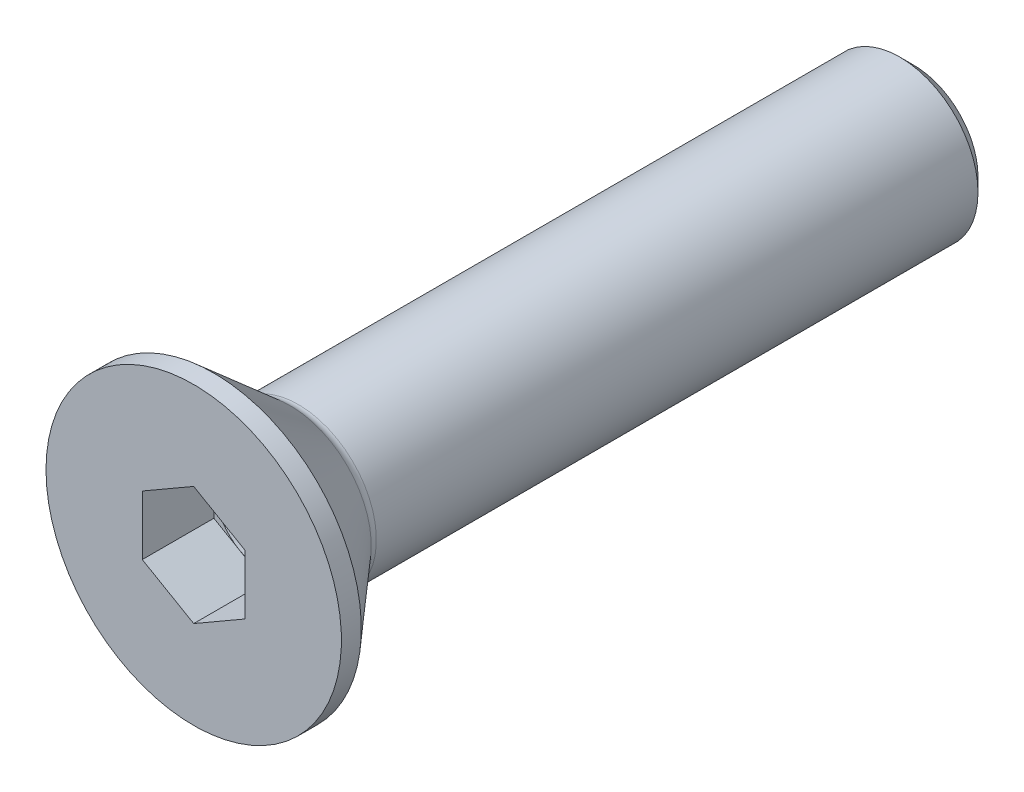
ISO-10303-21;
HEADER;
FILE_DESCRIPTION(('STEP AP214'),'2;1');
FILE_NAME('part.step','',(''),(''),'','','');
FILE_SCHEMA(('AUTOMOTIVE_DESIGN { 1 0 10303 214 1 1 1 1 }'));
ENDSEC;
DATA;
#1=APPLICATION_CONTEXT('core data for automotive mechanical design processes');
#2=APPLICATION_PROTOCOL_DEFINITION('international standard','automotive_design',2000,#1);
#3=PRODUCT_CONTEXT('',#1,'mechanical');
#4=PRODUCT('Part','Part','',(#3));
#5=PRODUCT_RELATED_PRODUCT_CATEGORY('part','',(#4));
#6=PRODUCT_DEFINITION_FORMATION('','',#4);
#7=PRODUCT_DEFINITION_CONTEXT('part definition',#1,'design');
#8=PRODUCT_DEFINITION('design','',#6,#7);
#9=PRODUCT_DEFINITION_SHAPE('','',#8);
#10=(LENGTH_UNIT() NAMED_UNIT(*) SI_UNIT(.MILLI.,.METRE.));
#11=(NAMED_UNIT(*) PLANE_ANGLE_UNIT() SI_UNIT($,.RADIAN.));
#12=(NAMED_UNIT(*) SI_UNIT($,.STERADIAN.) SOLID_ANGLE_UNIT());
#13=UNCERTAINTY_MEASURE_WITH_UNIT(LENGTH_MEASURE(1.E-05),#10,'distance_accuracy_value','');
#14=(GEOMETRIC_REPRESENTATION_CONTEXT(3) GLOBAL_UNCERTAINTY_ASSIGNED_CONTEXT((#13)) GLOBAL_UNIT_ASSIGNED_CONTEXT((#10,
#11,#12)) REPRESENTATION_CONTEXT('',''));
#15=CARTESIAN_POINT('',(0.,0.,0.));
#16=DIRECTION('',(0.,0.,1.));
#17=DIRECTION('',(1.,0.,0.));
#18=AXIS2_PLACEMENT_3D('',#15,#16,#17);
#19=CARTESIAN_POINT('',(0.,0.,-2.2098));
#20=DIRECTION('',(0.,0.,1.));
#21=DIRECTION('',(1.,0.,0.));
#22=AXIS2_PLACEMENT_3D('',#19,#20,#21);
#23=PLANE('',#22);
#24=CARTESIAN_POINT('',(0.,0.,-2.2098));
#25=DIRECTION('',(0.,0.,1.));
#26=DIRECTION('',(1.,0.,0.));
#27=AXIS2_PLACEMENT_3D('',#24,#25,#26);
#28=CIRCLE('',#27,1.5875);
#29=CARTESIAN_POINT('',(1.5875,0.,-2.2098));
#30=VERTEX_POINT('',#29);
#31=CARTESIAN_POINT('',(0.79375,1.3748153285078,-2.2098));
#32=VERTEX_POINT('',#31);
#33=EDGE_CURVE('E96',#30,#32,#28,.T.);
#34=ORIENTED_EDGE('',*,*,#33,.F.);
#35=DIRECTION('',(0.,-1.,0.));
#36=VECTOR('',#35,1.);
#37=CARTESIAN_POINT('',(1.5875,0.,-2.2098));
#38=LINE('',#37,#36);
#39=CARTESIAN_POINT('',(1.5875,0.91654355233853,-2.2098));
#40=VERTEX_POINT('',#39);
#41=EDGE_CURVE('E120',#40,#30,#38,.T.);
#42=ORIENTED_EDGE('',*,*,#41,.F.);
#43=DIRECTION('',(0.866025403784439,-0.5,0.));
#44=VECTOR('',#43,1.);
#45=CARTESIAN_POINT('',(1.82027223185862,0.782152441615087,-2.2098));
#46=LINE('',#45,#44);
#47=EDGE_CURVE('E118',#32,#40,#46,.T.);
#48=ORIENTED_EDGE('',*,*,#47,.F.);
#49=EDGE_LOOP('',(#34,#42,#48));
#50=FACE_BOUND('',#49,.T.);
#51=ADVANCED_FACE('F17',(#50),#23,.T.);
#52=CARTESIAN_POINT('',(-0.79375,1.3748153285078,-2.2098));
#53=VERTEX_POINT('',#52);
#54=EDGE_CURVE('E98',#32,#53,#28,.T.);
#55=ORIENTED_EDGE('',*,*,#54,.F.);
#56=CARTESIAN_POINT('',(0.,1.83308710467706,-2.2098));
#57=VERTEX_POINT('',#56);
#58=EDGE_CURVE('E113',#57,#32,#46,.T.);
#59=ORIENTED_EDGE('',*,*,#58,.F.);
#60=DIRECTION('',(0.866025403784438,0.5,0.));
#61=VECTOR('',#60,1.);
#62=CARTESIAN_POINT('',(-1.82027223185862,0.782152441615086,-2.2098));
#63=LINE('',#62,#61);
#64=EDGE_CURVE('E114',#53,#57,#63,.T.);
#65=ORIENTED_EDGE('',*,*,#64,.F.);
#66=EDGE_LOOP('',(#55,#59,#65));
#67=FACE_BOUND('',#66,.T.);
#68=ADVANCED_FACE('F111',(#67),#23,.T.);
#69=CARTESIAN_POINT('',(-1.5875,0.,-2.2098));
#70=VERTEX_POINT('',#69);
#71=EDGE_CURVE('E117',#53,#70,#28,.T.);
#72=ORIENTED_EDGE('',*,*,#71,.F.);
#73=CARTESIAN_POINT('',(-1.5875,0.91654355233853,-2.2098));
#74=VERTEX_POINT('',#73);
#75=EDGE_CURVE('E134',#74,#53,#63,.T.);
#76=ORIENTED_EDGE('',*,*,#75,.F.);
#77=DIRECTION('',(0.,1.,0.));
#78=VECTOR('',#77,1.);
#79=CARTESIAN_POINT('',(-1.5875,0.,-2.2098));
#80=LINE('',#79,#78);
#81=EDGE_CURVE('E138',#70,#74,#80,.T.);
#82=ORIENTED_EDGE('',*,*,#81,.F.);
#83=EDGE_LOOP('',(#72,#76,#82));
#84=FACE_BOUND('',#83,.T.);
#85=ADVANCED_FACE('F222',(#84),#23,.T.);
#86=CARTESIAN_POINT('',(-0.79375,-1.3748153285078,-2.2098));
#87=VERTEX_POINT('',#86);
#88=EDGE_CURVE('E247',#70,#87,#28,.T.);
#89=ORIENTED_EDGE('',*,*,#88,.F.);
#90=CARTESIAN_POINT('',(-1.5875,-0.91654355233853,-2.2098));
#91=VERTEX_POINT('',#90);
#92=EDGE_CURVE('E139',#91,#70,#80,.T.);
#93=ORIENTED_EDGE('',*,*,#92,.F.);
#94=DIRECTION('',(-0.866025403784439,0.5,0.));
#95=VECTOR('',#94,1.);
#96=CARTESIAN_POINT('',(0.232772231858619,-1.96747821540051,-2.2098));
#97=LINE('',#96,#95);
#98=EDGE_CURVE('E143',#87,#91,#97,.T.);
#99=ORIENTED_EDGE('',*,*,#98,.F.);
#100=EDGE_LOOP('',(#89,#93,#99));
#101=FACE_BOUND('',#100,.T.);
#102=ADVANCED_FACE('F234',(#101),#23,.T.);
#103=CARTESIAN_POINT('',(0.79375,-1.3748153285078,-2.2098));
#104=VERTEX_POINT('',#103);
#105=EDGE_CURVE('E33',#87,#104,#28,.T.);
#106=ORIENTED_EDGE('',*,*,#105,.F.);
#107=CARTESIAN_POINT('',(0.,-1.83308710467706,-2.2098));
#108=VERTEX_POINT('',#107);
#109=EDGE_CURVE('E144',#108,#87,#97,.T.);
#110=ORIENTED_EDGE('',*,*,#109,.F.);
#111=DIRECTION('',(-0.866025403784438,-0.5,0.));
#112=VECTOR('',#111,1.);
#113=CARTESIAN_POINT('',(1.82027223185862,-0.782152441615086,-2.2098));
#114=LINE('',#113,#112);
#115=EDGE_CURVE('E148',#104,#108,#114,.T.);
#116=ORIENTED_EDGE('',*,*,#115,.F.);
#117=EDGE_LOOP('',(#106,#110,#116));
#118=FACE_BOUND('',#117,.T.);
#119=ADVANCED_FACE('F227',(#118),#23,.T.);
#120=CARTESIAN_POINT('',(-2.27965,0.,0.));
#121=DIRECTION('',(0.,0.,-1.));
#122=DIRECTION('',(-1.,0.,0.));
#123=AXIS2_PLACEMENT_3D('',#120,#121,#122);
#124=PLANE('',#123);
#125=CARTESIAN_POINT('',(0.,0.,0.));
#126=DIRECTION('',(0.,0.,-1.));
#127=DIRECTION('',(-1.,0.,0.));
#128=AXIS2_PLACEMENT_3D('',#125,#126,#127);
#129=CIRCLE('',#128,4.5593);
#130=CARTESIAN_POINT('',(-4.5593,0.,0.));
#131=VERTEX_POINT('',#130);
#132=EDGE_CURVE('E204',#131,#131,#129,.T.);
#133=ORIENTED_EDGE('',*,*,#132,.F.);
#134=EDGE_LOOP('',(#133));
#135=FACE_BOUND('',#134,.T.);
#136=DIRECTION('',(0.866025403784439,-0.5,0.));
#137=VECTOR('',#136,1.);
#138=CARTESIAN_POINT('',(1.82027223185862,0.782152441615087,0.));
#139=LINE('',#138,#137);
#140=CARTESIAN_POINT('',(0.,1.83308710467706,0.));
#141=VERTEX_POINT('',#140);
#142=CARTESIAN_POINT('',(1.5875,0.91654355233853,0.));
#143=VERTEX_POINT('',#142);
#144=EDGE_CURVE('E106',#141,#143,#139,.T.);
#145=ORIENTED_EDGE('',*,*,#144,.T.);
#146=DIRECTION('',(0.,-1.,0.));
#147=VECTOR('',#146,1.);
#148=CARTESIAN_POINT('',(1.5875,0.,0.));
#149=LINE('',#148,#147);
#150=CARTESIAN_POINT('',(1.5875,-0.916543552338531,0.));
#151=VERTEX_POINT('',#150);
#152=EDGE_CURVE('E124',#143,#151,#149,.T.);
#153=ORIENTED_EDGE('',*,*,#152,.T.);
#154=DIRECTION('',(-0.866025403784438,-0.5,0.));
#155=VECTOR('',#154,1.);
#156=CARTESIAN_POINT('',(1.82027223185862,-0.782152441615086,0.));
#157=LINE('',#156,#155);
#158=CARTESIAN_POINT('',(0.,-1.83308710467706,0.));
#159=VERTEX_POINT('',#158);
#160=EDGE_CURVE('E41',#151,#159,#157,.T.);
#161=ORIENTED_EDGE('',*,*,#160,.T.);
#162=DIRECTION('',(-0.866025403784439,0.5,0.));
#163=VECTOR('',#162,1.);
#164=CARTESIAN_POINT('',(0.232772231858619,-1.96747821540051,0.));
#165=LINE('',#164,#163);
#166=CARTESIAN_POINT('',(-1.5875,-0.91654355233853,0.));
#167=VERTEX_POINT('',#166);
#168=EDGE_CURVE('E167',#159,#167,#165,.T.);
#169=ORIENTED_EDGE('',*,*,#168,.T.);
#170=DIRECTION('',(0.,1.,0.));
#171=VECTOR('',#170,1.);
#172=CARTESIAN_POINT('',(-1.5875,0.,0.));
#173=LINE('',#172,#171);
#174=CARTESIAN_POINT('',(-1.5875,0.91654355233853,0.));
#175=VERTEX_POINT('',#174);
#176=EDGE_CURVE('E163',#167,#175,#173,.T.);
#177=ORIENTED_EDGE('',*,*,#176,.T.);
#178=DIRECTION('',(0.866025403784438,0.5,0.));
#179=VECTOR('',#178,1.);
#180=CARTESIAN_POINT('',(-1.82027223185862,0.782152441615086,0.));
#181=LINE('',#180,#179);
#182=EDGE_CURVE('E159',#175,#141,#181,.T.);
#183=ORIENTED_EDGE('',*,*,#182,.T.);
#184=EDGE_LOOP('',(#145,#153,#161,#169,#177,#183));
#185=FACE_BOUND('',#184,.T.);
#186=ADVANCED_FACE('F233',(#135,#185),#124,.F.);
#187=CARTESIAN_POINT('',(0.,0.,3.39570524304279));
#188=DIRECTION('',(0.,0.,-1.));
#189=DIRECTION('',(-1.,0.,0.));
#190=AXIS2_PLACEMENT_3D('',#187,#188,#189);
#191=CYLINDRICAL_SURFACE('',#190,2.413);
#192=CARTESIAN_POINT('',(0.,0.,-21.79605761938));
#193=DIRECTION('',(0.,0.,1.));
#194=DIRECTION('',(1.,0.,0.));
#195=AXIS2_PLACEMENT_3D('',#192,#193,#194);
#196=CIRCLE('',#195,2.413);
#197=CARTESIAN_POINT('',(2.413,0.,-21.79605761938));
#198=VERTEX_POINT('',#197);
#199=EDGE_CURVE('E11',#198,#198,#196,.T.);
#200=ORIENTED_EDGE('',*,*,#199,.T.);
#201=EDGE_LOOP('',(#200));
#202=FACE_BOUND('',#201,.T.);
#203=CARTESIAN_POINT('',(0.,0.,-3.2258));
#204=DIRECTION('',(0.,0.,-1.));
#205=DIRECTION('',(-1.,0.,0.));
#206=AXIS2_PLACEMENT_3D('',#203,#204,#205);
#207=CIRCLE('',#206,2.413);
#208=CARTESIAN_POINT('',(-2.413,0.,-3.2258));
#209=VERTEX_POINT('',#208);
#210=EDGE_CURVE('E192',#209,#209,#207,.T.);
#211=ORIENTED_EDGE('',*,*,#210,.T.);
#212=EDGE_LOOP('',(#211));
#213=FACE_BOUND('',#212,.T.);
#214=ADVANCED_FACE('F239',(#202,#213),#191,.T.);
#215=CARTESIAN_POINT('',(-1.2065,0.,-22.225));
#216=DIRECTION('',(0.,0.,1.));
#217=DIRECTION('',(1.,0.,0.));
#218=AXIS2_PLACEMENT_3D('',#215,#216,#217);
#219=PLANE('',#218);
#220=CARTESIAN_POINT('',(0.,0.,-22.225));
#221=DIRECTION('',(0.,0.,1.));
#222=DIRECTION('',(1.,0.,0.));
#223=AXIS2_PLACEMENT_3D('',#220,#221,#222);
#224=CIRCLE('',#223,1.98405761938);
#225=CARTESIAN_POINT('',(1.98405761938,0.,-22.225));
#226=VERTEX_POINT('',#225);
#227=EDGE_CURVE('E26',#226,#226,#224,.F.);
#228=ORIENTED_EDGE('',*,*,#227,.T.);
#229=EDGE_LOOP('',(#228));
#230=FACE_BOUND('',#229,.T.);
#231=ADVANCED_FACE('F211',(#230),#219,.F.);
#232=CARTESIAN_POINT('',(0.,0.,3.39570524304279));
#233=DIRECTION('',(0.,0.,-1.));
#234=DIRECTION('',(-1.,0.,0.));
#235=AXIS2_PLACEMENT_3D('',#232,#233,#234);
#236=CYLINDRICAL_SURFACE('',#235,4.5593);
#237=CARTESIAN_POINT('',(0.,0.,-0.614314224697838));
#238=DIRECTION('',(0.,0.,-1.));
#239=DIRECTION('',(-1.,0.,0.));
#240=AXIS2_PLACEMENT_3D('',#237,#238,#239);
#241=CIRCLE('',#240,4.5593);
#242=CARTESIAN_POINT('',(-4.5593,0.,-0.614314224697838));
#243=VERTEX_POINT('',#242);
#244=EDGE_CURVE('E200',#243,#243,#241,.T.);
#245=ORIENTED_EDGE('',*,*,#244,.F.);
#246=EDGE_LOOP('',(#245));
#247=FACE_BOUND('',#246,.T.);
#248=ORIENTED_EDGE('',*,*,#132,.T.);
#249=EDGE_LOOP('',(#248));
#250=FACE_BOUND('',#249,.T.);
#251=ADVANCED_FACE('F293',(#247,#250),#236,.T.);
#252=CARTESIAN_POINT('',(0.,0.,-0.614314224697838));
#253=DIRECTION('',(0.,0.,1.));
#254=DIRECTION('',(1.,0.,0.));
#255=AXIS2_PLACEMENT_3D('',#252,#253,#254);
#256=CONICAL_SURFACE('',#255,4.5593,0.715584993317675);
#257=CARTESIAN_POINT('',(0.,0.,-2.97584150995462));
#258=DIRECTION('',(0.,0.,-1.));
#259=DIRECTION('',(-1.,0.,0.));
#260=AXIS2_PLACEMENT_3D('',#257,#258,#259);
#261=CIRCLE('',#260,2.50645564993513);
#262=CARTESIAN_POINT('',(-2.50645564993513,0.,-2.97584150995462));
#263=VERTEX_POINT('',#262);
#264=EDGE_CURVE('E196',#263,#263,#261,.T.);
#265=ORIENTED_EDGE('',*,*,#264,.F.);
#266=EDGE_LOOP('',(#265));
#267=FACE_BOUND('',#266,.T.);
#268=ORIENTED_EDGE('',*,*,#244,.T.);
#269=EDGE_LOOP('',(#268));
#270=FACE_BOUND('',#269,.T.);
#271=ADVANCED_FACE('F289',(#267,#270),#256,.T.);
#272=CARTESIAN_POINT('',(0.,0.,-3.2258));
#273=DIRECTION('',(0.,0.,-1.));
#274=DIRECTION('',(-1.,0.,0.));
#275=AXIS2_PLACEMENT_3D('',#272,#273,#274);
#276=TOROIDAL_SURFACE('',#275,2.794,0.381);
#277=ORIENTED_EDGE('',*,*,#264,.T.);
#278=EDGE_LOOP('',(#277));
#279=FACE_BOUND('',#278,.T.);
#280=ORIENTED_EDGE('',*,*,#210,.F.);
#281=EDGE_LOOP('',(#280));
#282=FACE_BOUND('',#281,.T.);
#283=ADVANCED_FACE('F283',(#279,#282),#276,.F.);
#284=CARTESIAN_POINT('',(1.82027223185862,0.782152441615087,-2.2098));
#285=DIRECTION('',(-0.5,-0.866025403784439,0.));
#286=DIRECTION('',(0.866025403784439,-0.5,0.));
#287=AXIS2_PLACEMENT_3D('',#284,#285,#286);
#288=PLANE('',#287);
#289=ORIENTED_EDGE('',*,*,#144,.F.);
#290=DIRECTION('',(0.,0.,1.));
#291=VECTOR('',#290,1.);
#292=CARTESIAN_POINT('',(0.,1.83308710467706,-2.2098));
#293=LINE('',#292,#291);
#294=EDGE_CURVE('E129',#57,#141,#293,.T.);
#295=ORIENTED_EDGE('',*,*,#294,.F.);
#296=ORIENTED_EDGE('',*,*,#58,.T.);
#297=ORIENTED_EDGE('',*,*,#47,.T.);
#298=DIRECTION('',(0.,0.,1.));
#299=VECTOR('',#298,1.);
#300=CARTESIAN_POINT('',(1.5875,0.91654355233853,-2.2098));
#301=LINE('',#300,#299);
#302=EDGE_CURVE('E155',#40,#143,#301,.T.);
#303=ORIENTED_EDGE('',*,*,#302,.T.);
#304=EDGE_LOOP('',(#289,#295,#296,#297,#303));
#305=FACE_BOUND('',#304,.T.);
#306=ADVANCED_FACE('F128',(#305),#288,.T.);
#307=CARTESIAN_POINT('',(-1.82027223185862,0.782152441615086,-2.2098));
#308=DIRECTION('',(0.5,-0.866025403784438,0.));
#309=DIRECTION('',(0.866025403784439,0.5,0.));
#310=AXIS2_PLACEMENT_3D('',#307,#308,#309);
#311=PLANE('',#310);
#312=ORIENTED_EDGE('',*,*,#182,.F.);
#313=DIRECTION('',(0.,0.,1.));
#314=VECTOR('',#313,1.);
#315=CARTESIAN_POINT('',(-1.5875,0.91654355233853,-2.2098));
#316=LINE('',#315,#314);
#317=EDGE_CURVE('E187',#74,#175,#316,.T.);
#318=ORIENTED_EDGE('',*,*,#317,.F.);
#319=ORIENTED_EDGE('',*,*,#75,.T.);
#320=ORIENTED_EDGE('',*,*,#64,.T.);
#321=ORIENTED_EDGE('',*,*,#294,.T.);
#322=EDGE_LOOP('',(#312,#318,#319,#320,#321));
#323=FACE_BOUND('',#322,.T.);
#324=ADVANCED_FACE('F276',(#323),#311,.T.);
#325=CARTESIAN_POINT('',(-1.5875,0.,-2.2098));
#326=DIRECTION('',(1.,0.,0.));
#327=DIRECTION('',(0.,1.,0.));
#328=AXIS2_PLACEMENT_3D('',#325,#326,#327);
#329=PLANE('',#328);
#330=ORIENTED_EDGE('',*,*,#176,.F.);
#331=DIRECTION('',(0.,0.,1.));
#332=VECTOR('',#331,1.);
#333=CARTESIAN_POINT('',(-1.5875,-0.91654355233853,-2.2098));
#334=LINE('',#333,#332);
#335=EDGE_CURVE('E184',#91,#167,#334,.T.);
#336=ORIENTED_EDGE('',*,*,#335,.F.);
#337=ORIENTED_EDGE('',*,*,#92,.T.);
#338=ORIENTED_EDGE('',*,*,#81,.T.);
#339=ORIENTED_EDGE('',*,*,#317,.T.);
#340=EDGE_LOOP('',(#330,#336,#337,#338,#339));
#341=FACE_BOUND('',#340,.T.);
#342=ADVANCED_FACE('F271',(#341),#329,.T.);
#343=CARTESIAN_POINT('',(0.232772231858619,-1.96747821540051,-2.2098));
#344=DIRECTION('',(0.5,0.866025403784439,0.));
#345=DIRECTION('',(-0.866025403784439,0.5,0.));
#346=AXIS2_PLACEMENT_3D('',#343,#344,#345);
#347=PLANE('',#346);
#348=ORIENTED_EDGE('',*,*,#168,.F.);
#349=DIRECTION('',(0.,0.,1.));
#350=VECTOR('',#349,1.);
#351=CARTESIAN_POINT('',(0.,-1.83308710467706,-2.2098));
#352=LINE('',#351,#350);
#353=EDGE_CURVE('E181',#108,#159,#352,.T.);
#354=ORIENTED_EDGE('',*,*,#353,.F.);
#355=ORIENTED_EDGE('',*,*,#109,.T.);
#356=ORIENTED_EDGE('',*,*,#98,.T.);
#357=ORIENTED_EDGE('',*,*,#335,.T.);
#358=EDGE_LOOP('',(#348,#354,#355,#356,#357));
#359=FACE_BOUND('',#358,.T.);
#360=ADVANCED_FACE('F256',(#359),#347,.T.);
#361=CARTESIAN_POINT('',(1.82027223185862,-0.782152441615086,-2.2098));
#362=DIRECTION('',(-0.5,0.866025403784438,0.));
#363=DIRECTION('',(-0.866025403784438,-0.5,0.));
#364=AXIS2_PLACEMENT_3D('',#361,#362,#363);
#365=PLANE('',#364);
#366=ORIENTED_EDGE('',*,*,#160,.F.);
#367=DIRECTION('',(0.,0.,1.));
#368=VECTOR('',#367,1.);
#369=CARTESIAN_POINT('',(1.5875,-0.916543552338531,-2.2098));
#370=LINE('',#369,#368);
#371=CARTESIAN_POINT('',(1.5875,-0.916543552338531,-2.2098));
#372=VERTEX_POINT('',#371);
#373=EDGE_CURVE('E178',#372,#151,#370,.T.);
#374=ORIENTED_EDGE('',*,*,#373,.F.);
#375=EDGE_CURVE('E149',#372,#104,#114,.T.);
#376=ORIENTED_EDGE('',*,*,#375,.T.);
#377=ORIENTED_EDGE('',*,*,#115,.T.);
#378=ORIENTED_EDGE('',*,*,#353,.T.);
#379=EDGE_LOOP('',(#366,#374,#376,#377,#378));
#380=FACE_BOUND('',#379,.T.);
#381=ADVANCED_FACE('F230',(#380),#365,.T.);
#382=CARTESIAN_POINT('',(1.5875,0.,-2.2098));
#383=DIRECTION('',(-1.,0.,0.));
#384=DIRECTION('',(0.,-1.,0.));
#385=AXIS2_PLACEMENT_3D('',#382,#383,#384);
#386=PLANE('',#385);
#387=ORIENTED_EDGE('',*,*,#152,.F.);
#388=ORIENTED_EDGE('',*,*,#302,.F.);
#389=ORIENTED_EDGE('',*,*,#41,.T.);
#390=EDGE_CURVE('E152',#30,#372,#38,.T.);
#391=ORIENTED_EDGE('',*,*,#390,.T.);
#392=ORIENTED_EDGE('',*,*,#373,.T.);
#393=EDGE_LOOP('',(#387,#388,#389,#391,#392));
#394=FACE_BOUND('',#393,.T.);
#395=ADVANCED_FACE('F225',(#394),#386,.T.);
#396=EDGE_CURVE('E100',#104,#30,#28,.T.);
#397=ORIENTED_EDGE('',*,*,#396,.F.);
#398=ORIENTED_EDGE('',*,*,#375,.F.);
#399=ORIENTED_EDGE('',*,*,#390,.F.);
#400=EDGE_LOOP('',(#397,#398,#399));
#401=FACE_BOUND('',#400,.T.);
#402=ADVANCED_FACE('F93',(#401),#23,.T.);
#403=CARTESIAN_POINT('',(0.,0.,-2.2098));
#404=DIRECTION('',(0.,0.,1.));
#405=DIRECTION('',(1.,0.,0.));
#406=AXIS2_PLACEMENT_3D('',#403,#404,#405);
#407=CONICAL_SURFACE('',#406,1.5875,1.22173047639603);
#408=CARTESIAN_POINT('',(0.,0.,-2.7876027468976));
#409=VERTEX_POINT('',#408);
#410=VERTEX_LOOP('',#409);
#411=FACE_BOUND('',#410,.T.);
#412=ORIENTED_EDGE('',*,*,#33,.T.);
#413=ORIENTED_EDGE('',*,*,#54,.T.);
#414=ORIENTED_EDGE('',*,*,#71,.T.);
#415=ORIENTED_EDGE('',*,*,#88,.T.);
#416=ORIENTED_EDGE('',*,*,#105,.T.);
#417=ORIENTED_EDGE('',*,*,#396,.T.);
#418=EDGE_LOOP('',(#412,#413,#414,#415,#416,#417));
#419=FACE_BOUND('',#418,.T.);
#420=ADVANCED_FACE('F91',(#411,#419),#407,.F.);
#421=CARTESIAN_POINT('',(0.,0.,-22.225));
#422=DIRECTION('',(0.,0.,1.));
#423=DIRECTION('',(1.,0.,0.));
#424=AXIS2_PLACEMENT_3D('',#421,#422,#423);
#425=CONICAL_SURFACE('',#424,1.98405761938,0.785398163397449);
#426=ORIENTED_EDGE('',*,*,#199,.F.);
#427=EDGE_LOOP('',(#426));
#428=FACE_BOUND('',#427,.T.);
#429=ORIENTED_EDGE('',*,*,#227,.F.);
#430=EDGE_LOOP('',(#429));
#431=FACE_BOUND('',#430,.T.);
#432=ADVANCED_FACE('F19',(#428,#431),#425,.T.);
#433=CLOSED_SHELL('',(#51,#68,#85,#102,#119,#186,#214,#231,#251,#271,#283,#306,#324,#342,#360,
#381,#395,#402,#420,#432));
#434=MANIFOLD_SOLID_BREP('B1',#433);
#435=ADVANCED_BREP_SHAPE_REPRESENTATION('',(#18,#434),#14);
#436=SHAPE_DEFINITION_REPRESENTATION(#9,#435);
ENDSEC;
END-ISO-10303-21;
